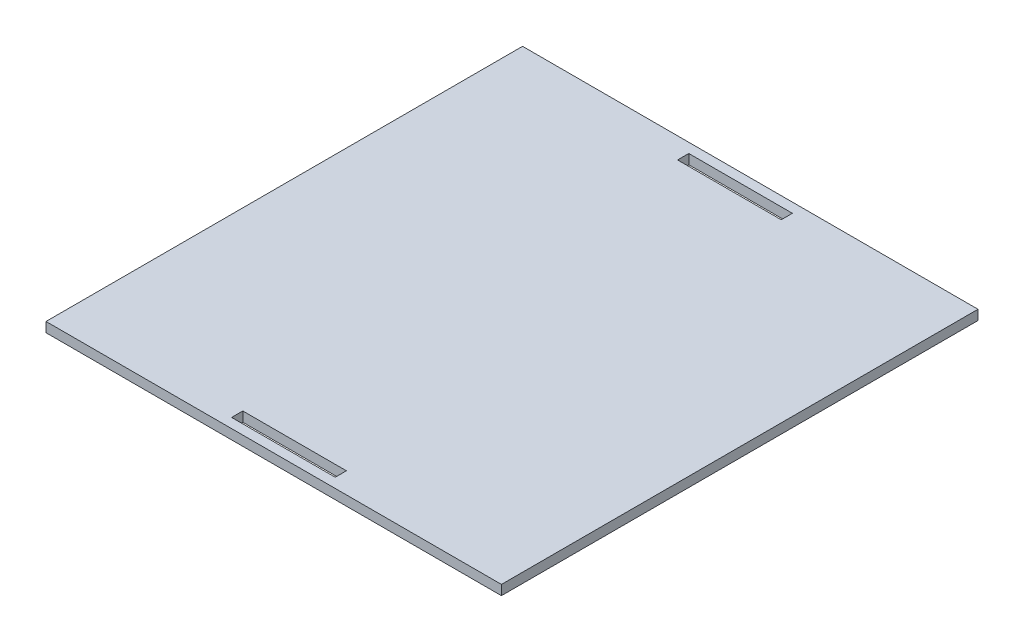
ISO-10303-21;
HEADER;
FILE_DESCRIPTION(('STEP AP214'),'2;1');
FILE_NAME('part.step','',(''),(''),'','','');
FILE_SCHEMA(('AUTOMOTIVE_DESIGN { 1 0 10303 214 1 1 1 1 }'));
ENDSEC;
DATA;
#1=APPLICATION_CONTEXT('core data for automotive mechanical design processes');
#2=APPLICATION_PROTOCOL_DEFINITION('international standard','automotive_design',2000,#1);
#3=PRODUCT_CONTEXT('',#1,'mechanical');
#4=PRODUCT('Part','Part','',(#3));
#5=PRODUCT_RELATED_PRODUCT_CATEGORY('part','',(#4));
#6=PRODUCT_DEFINITION_FORMATION('','',#4);
#7=PRODUCT_DEFINITION_CONTEXT('part definition',#1,'design');
#8=PRODUCT_DEFINITION('design','',#6,#7);
#9=PRODUCT_DEFINITION_SHAPE('','',#8);
#10=(LENGTH_UNIT() NAMED_UNIT(*) SI_UNIT(.MILLI.,.METRE.));
#11=(NAMED_UNIT(*) PLANE_ANGLE_UNIT() SI_UNIT($,.RADIAN.));
#12=(NAMED_UNIT(*) SI_UNIT($,.STERADIAN.) SOLID_ANGLE_UNIT());
#13=UNCERTAINTY_MEASURE_WITH_UNIT(LENGTH_MEASURE(1.E-05),#10,'distance_accuracy_value','');
#14=(GEOMETRIC_REPRESENTATION_CONTEXT(3) GLOBAL_UNCERTAINTY_ASSIGNED_CONTEXT((#13)) GLOBAL_UNIT_ASSIGNED_CONTEXT((#10,
#11,#12)) REPRESENTATION_CONTEXT('',''));
#15=CARTESIAN_POINT('',(0.,0.,0.));
#16=DIRECTION('',(0.,0.,1.));
#17=DIRECTION('',(1.,0.,0.));
#18=AXIS2_PLACEMENT_3D('',#15,#16,#17);
#19=CARTESIAN_POINT('',(0.,2.9972,0.));
#20=DIRECTION('',(0.,1.,0.));
#21=DIRECTION('',(0.,0.,1.));
#22=AXIS2_PLACEMENT_3D('',#19,#20,#21);
#23=PLANE('',#22);
#24=DIRECTION('',(0.,0.,1.));
#25=VECTOR('',#24,1.);
#26=CARTESIAN_POINT('',(-69.7864999999999,2.9972,73.025));
#27=LINE('',#26,#25);
#28=CARTESIAN_POINT('',(-69.7865,2.9972,-73.025));
#29=VERTEX_POINT('',#28);
#30=CARTESIAN_POINT('',(-69.7864999999999,2.9972,73.025));
#31=VERTEX_POINT('',#30);
#32=EDGE_CURVE('E220',#29,#31,#27,.T.);
#33=ORIENTED_EDGE('',*,*,#32,.T.);
#34=DIRECTION('',(1.,0.,0.));
#35=VECTOR('',#34,1.);
#36=CARTESIAN_POINT('',(69.7865000000001,2.9972,73.025));
#37=LINE('',#36,#35);
#38=CARTESIAN_POINT('',(69.7865000000001,2.9972,73.025));
#39=VERTEX_POINT('',#38);
#40=EDGE_CURVE('E224',#31,#39,#37,.T.);
#41=ORIENTED_EDGE('',*,*,#40,.T.);
#42=DIRECTION('',(0.,0.,-1.));
#43=VECTOR('',#42,1.);
#44=CARTESIAN_POINT('',(69.7865000000001,2.9972,73.025));
#45=LINE('',#44,#43);
#46=CARTESIAN_POINT('',(69.7865000000001,2.9972,-73.025));
#47=VERTEX_POINT('',#46);
#48=EDGE_CURVE('E228',#39,#47,#45,.T.);
#49=ORIENTED_EDGE('',*,*,#48,.T.);
#50=DIRECTION('',(-1.,0.,0.));
#51=VECTOR('',#50,1.);
#52=CARTESIAN_POINT('',(69.7865000000001,2.9972,-73.025));
#53=LINE('',#52,#51);
#54=EDGE_CURVE('E231',#47,#29,#53,.T.);
#55=ORIENTED_EDGE('',*,*,#54,.T.);
#56=EDGE_LOOP('',(#33,#41,#49,#55));
#57=FACE_BOUND('',#56,.T.);
#58=DIRECTION('',(1.,0.,0.));
#59=VECTOR('',#58,1.);
#60=CARTESIAN_POINT('',(-15.875,2.9972,-66.6242));
#61=LINE('',#60,#59);
#62=CARTESIAN_POINT('',(-15.875,2.9972,-66.6242));
#63=VERTEX_POINT('',#62);
#64=CARTESIAN_POINT('',(15.875,2.9972,-66.6242));
#65=VERTEX_POINT('',#64);
#66=EDGE_CURVE('E180',#63,#65,#61,.T.);
#67=ORIENTED_EDGE('',*,*,#66,.F.);
#68=DIRECTION('',(0.,0.,1.));
#69=VECTOR('',#68,1.);
#70=CARTESIAN_POINT('',(-15.875,2.9972,-70.0532));
#71=LINE('',#70,#69);
#72=CARTESIAN_POINT('',(-15.875,2.9972,-70.0532));
#73=VERTEX_POINT('',#72);
#74=EDGE_CURVE('E177',#73,#63,#71,.T.);
#75=ORIENTED_EDGE('',*,*,#74,.F.);
#76=DIRECTION('',(-1.,0.,0.));
#77=VECTOR('',#76,1.);
#78=CARTESIAN_POINT('',(-15.875,2.9972,-70.0532));
#79=LINE('',#78,#77);
#80=CARTESIAN_POINT('',(15.875,2.9972,-70.0532));
#81=VERTEX_POINT('',#80);
#82=EDGE_CURVE('E188',#81,#73,#79,.T.);
#83=ORIENTED_EDGE('',*,*,#82,.F.);
#84=DIRECTION('',(0.,0.,-1.));
#85=VECTOR('',#84,1.);
#86=CARTESIAN_POINT('',(15.875,2.9972,-70.0532));
#87=LINE('',#86,#85);
#88=EDGE_CURVE('E184',#65,#81,#87,.T.);
#89=ORIENTED_EDGE('',*,*,#88,.F.);
#90=EDGE_LOOP('',(#67,#75,#83,#89));
#91=FACE_BOUND('',#90,.T.);
#92=DIRECTION('',(1.,0.,0.));
#93=VECTOR('',#92,1.);
#94=CARTESIAN_POINT('',(-15.875,2.9972,70.0532));
#95=LINE('',#94,#93);
#96=CARTESIAN_POINT('',(-15.875,2.9972,70.0532));
#97=VERTEX_POINT('',#96);
#98=CARTESIAN_POINT('',(15.875,2.9972,70.0532));
#99=VERTEX_POINT('',#98);
#100=EDGE_CURVE('E138',#97,#99,#95,.T.);
#101=ORIENTED_EDGE('',*,*,#100,.F.);
#102=DIRECTION('',(0.,0.,1.));
#103=VECTOR('',#102,1.);
#104=CARTESIAN_POINT('',(-15.875,2.9972,66.6242));
#105=LINE('',#104,#103);
#106=CARTESIAN_POINT('',(-15.875,2.9972,66.6242));
#107=VERTEX_POINT('',#106);
#108=EDGE_CURVE('E129',#107,#97,#105,.T.);
#109=ORIENTED_EDGE('',*,*,#108,.F.);
#110=DIRECTION('',(-1.,0.,0.));
#111=VECTOR('',#110,1.);
#112=CARTESIAN_POINT('',(-15.875,2.9972,66.6242));
#113=LINE('',#112,#111);
#114=CARTESIAN_POINT('',(15.875,2.9972,66.6242));
#115=VERTEX_POINT('',#114);
#116=EDGE_CURVE('E155',#115,#107,#113,.T.);
#117=ORIENTED_EDGE('',*,*,#116,.F.);
#118=DIRECTION('',(0.,0.,-1.));
#119=VECTOR('',#118,1.);
#120=CARTESIAN_POINT('',(15.875,2.9972,66.6242));
#121=LINE('',#120,#119);
#122=EDGE_CURVE('E151',#99,#115,#121,.T.);
#123=ORIENTED_EDGE('',*,*,#122,.F.);
#124=EDGE_LOOP('',(#101,#109,#117,#123));
#125=FACE_BOUND('',#124,.T.);
#126=ADVANCED_FACE('F39',(#57,#91,#125),#23,.T.);
#127=CARTESIAN_POINT('',(0.,0.,0.));
#128=DIRECTION('',(0.,1.,0.));
#129=DIRECTION('',(0.,0.,1.));
#130=AXIS2_PLACEMENT_3D('',#127,#128,#129);
#131=PLANE('',#130);
#132=DIRECTION('',(0.,0.,1.));
#133=VECTOR('',#132,1.);
#134=CARTESIAN_POINT('',(-15.875,0.,-70.0532));
#135=LINE('',#134,#133);
#136=CARTESIAN_POINT('',(-15.875,0.,-70.0532));
#137=VERTEX_POINT('',#136);
#138=CARTESIAN_POINT('',(-15.875,0.,-66.6242));
#139=VERTEX_POINT('',#138);
#140=EDGE_CURVE('E147',#137,#139,#135,.T.);
#141=ORIENTED_EDGE('',*,*,#140,.T.);
#142=DIRECTION('',(1.,0.,0.));
#143=VECTOR('',#142,1.);
#144=CARTESIAN_POINT('',(-15.875,0.,-66.6242));
#145=LINE('',#144,#143);
#146=CARTESIAN_POINT('',(15.875,0.,-66.6242));
#147=VERTEX_POINT('',#146);
#148=EDGE_CURVE('E195',#139,#147,#145,.T.);
#149=ORIENTED_EDGE('',*,*,#148,.T.);
#150=DIRECTION('',(0.,0.,-1.));
#151=VECTOR('',#150,1.);
#152=CARTESIAN_POINT('',(15.875,0.,-70.0532));
#153=LINE('',#152,#151);
#154=CARTESIAN_POINT('',(15.875,0.,-70.0532));
#155=VERTEX_POINT('',#154);
#156=EDGE_CURVE('E199',#147,#155,#153,.T.);
#157=ORIENTED_EDGE('',*,*,#156,.T.);
#158=DIRECTION('',(-1.,0.,0.));
#159=VECTOR('',#158,1.);
#160=CARTESIAN_POINT('',(-15.875,0.,-70.0532));
#161=LINE('',#160,#159);
#162=EDGE_CURVE('E181',#155,#137,#161,.T.);
#163=ORIENTED_EDGE('',*,*,#162,.T.);
#164=EDGE_LOOP('',(#141,#149,#157,#163));
#165=FACE_BOUND('',#164,.T.);
#166=DIRECTION('',(0.,0.,1.));
#167=VECTOR('',#166,1.);
#168=CARTESIAN_POINT('',(-69.7864999999999,0.,73.025));
#169=LINE('',#168,#167);
#170=CARTESIAN_POINT('',(-69.7865,0.,-73.025));
#171=VERTEX_POINT('',#170);
#172=CARTESIAN_POINT('',(-69.7864999999999,0.,73.025));
#173=VERTEX_POINT('',#172);
#174=EDGE_CURVE('E219',#171,#173,#169,.T.);
#175=ORIENTED_EDGE('',*,*,#174,.F.);
#176=DIRECTION('',(-1.,0.,0.));
#177=VECTOR('',#176,1.);
#178=CARTESIAN_POINT('',(69.7865000000001,0.,-73.025));
#179=LINE('',#178,#177);
#180=CARTESIAN_POINT('',(69.7865000000001,0.,-73.025));
#181=VERTEX_POINT('',#180);
#182=EDGE_CURVE('E225',#181,#171,#179,.T.);
#183=ORIENTED_EDGE('',*,*,#182,.F.);
#184=DIRECTION('',(0.,0.,-1.));
#185=VECTOR('',#184,1.);
#186=CARTESIAN_POINT('',(69.7865000000001,0.,73.025));
#187=LINE('',#186,#185);
#188=CARTESIAN_POINT('',(69.7865000000001,0.,73.025));
#189=VERTEX_POINT('',#188);
#190=EDGE_CURVE('E241',#189,#181,#187,.T.);
#191=ORIENTED_EDGE('',*,*,#190,.F.);
#192=DIRECTION('',(1.,0.,0.));
#193=VECTOR('',#192,1.);
#194=CARTESIAN_POINT('',(69.7865000000001,0.,73.025));
#195=LINE('',#194,#193);
#196=EDGE_CURVE('E238',#173,#189,#195,.T.);
#197=ORIENTED_EDGE('',*,*,#196,.F.);
#198=EDGE_LOOP('',(#175,#183,#191,#197));
#199=FACE_BOUND('',#198,.T.);
#200=DIRECTION('',(0.,0.,1.));
#201=VECTOR('',#200,1.);
#202=CARTESIAN_POINT('',(-15.875,0.,66.6242));
#203=LINE('',#202,#201);
#204=CARTESIAN_POINT('',(-15.875,0.,66.6242));
#205=VERTEX_POINT('',#204);
#206=CARTESIAN_POINT('',(-15.875,0.,70.0532));
#207=VERTEX_POINT('',#206);
#208=EDGE_CURVE('E63',#205,#207,#203,.T.);
#209=ORIENTED_EDGE('',*,*,#208,.T.);
#210=DIRECTION('',(1.,0.,0.));
#211=VECTOR('',#210,1.);
#212=CARTESIAN_POINT('',(-15.875,0.,70.0532));
#213=LINE('',#212,#211);
#214=CARTESIAN_POINT('',(15.875,0.,70.0532));
#215=VERTEX_POINT('',#214);
#216=EDGE_CURVE('E145',#207,#215,#213,.T.);
#217=ORIENTED_EDGE('',*,*,#216,.T.);
#218=DIRECTION('',(0.,0.,-1.));
#219=VECTOR('',#218,1.);
#220=CARTESIAN_POINT('',(15.875,0.,66.6242));
#221=LINE('',#220,#219);
#222=CARTESIAN_POINT('',(15.875,0.,66.6242));
#223=VERTEX_POINT('',#222);
#224=EDGE_CURVE('E164',#215,#223,#221,.T.);
#225=ORIENTED_EDGE('',*,*,#224,.T.);
#226=DIRECTION('',(-1.,0.,0.));
#227=VECTOR('',#226,1.);
#228=CARTESIAN_POINT('',(-15.875,0.,66.6242));
#229=LINE('',#228,#227);
#230=EDGE_CURVE('E139',#223,#205,#229,.T.);
#231=ORIENTED_EDGE('',*,*,#230,.T.);
#232=EDGE_LOOP('',(#209,#217,#225,#231));
#233=FACE_BOUND('',#232,.T.);
#234=ADVANCED_FACE('F264',(#165,#199,#233),#131,.F.);
#235=CARTESIAN_POINT('',(-69.7864999999999,2.9972,73.025));
#236=DIRECTION('',(1.,0.,0.));
#237=DIRECTION('',(0.,0.,-1.));
#238=AXIS2_PLACEMENT_3D('',#235,#236,#237);
#239=PLANE('',#238);
#240=ORIENTED_EDGE('',*,*,#174,.T.);
#241=DIRECTION('',(0.,-1.,0.));
#242=VECTOR('',#241,1.);
#243=CARTESIAN_POINT('',(-69.7864999999999,2.9972,73.025));
#244=LINE('',#243,#242);
#245=EDGE_CURVE('E11',#31,#173,#244,.T.);
#246=ORIENTED_EDGE('',*,*,#245,.F.);
#247=ORIENTED_EDGE('',*,*,#32,.F.);
#248=DIRECTION('',(0.,-1.,0.));
#249=VECTOR('',#248,1.);
#250=CARTESIAN_POINT('',(-69.7865,2.9972,-73.025));
#251=LINE('',#250,#249);
#252=EDGE_CURVE('E234',#29,#171,#251,.T.);
#253=ORIENTED_EDGE('',*,*,#252,.T.);
#254=EDGE_LOOP('',(#240,#246,#247,#253));
#255=FACE_BOUND('',#254,.T.);
#256=ADVANCED_FACE('F41',(#255),#239,.F.);
#257=CARTESIAN_POINT('',(69.7865000000001,2.9972,73.025));
#258=DIRECTION('',(0.,0.,-1.));
#259=DIRECTION('',(-1.,0.,0.));
#260=AXIS2_PLACEMENT_3D('',#257,#258,#259);
#261=PLANE('',#260);
#262=ORIENTED_EDGE('',*,*,#196,.T.);
#263=DIRECTION('',(0.,-1.,0.));
#264=VECTOR('',#263,1.);
#265=CARTESIAN_POINT('',(69.7865000000001,2.9972,73.025));
#266=LINE('',#265,#264);
#267=EDGE_CURVE('E48',#39,#189,#266,.T.);
#268=ORIENTED_EDGE('',*,*,#267,.F.);
#269=ORIENTED_EDGE('',*,*,#40,.F.);
#270=ORIENTED_EDGE('',*,*,#245,.T.);
#271=EDGE_LOOP('',(#262,#268,#269,#270));
#272=FACE_BOUND('',#271,.T.);
#273=ADVANCED_FACE('F275',(#272),#261,.F.);
#274=CARTESIAN_POINT('',(69.7865000000001,2.9972,73.025));
#275=DIRECTION('',(-1.,0.,0.));
#276=DIRECTION('',(0.,0.,1.));
#277=AXIS2_PLACEMENT_3D('',#274,#275,#276);
#278=PLANE('',#277);
#279=ORIENTED_EDGE('',*,*,#190,.T.);
#280=DIRECTION('',(0.,-1.,0.));
#281=VECTOR('',#280,1.);
#282=CARTESIAN_POINT('',(69.7865000000001,2.9972,-73.025));
#283=LINE('',#282,#281);
#284=EDGE_CURVE('E249',#47,#181,#283,.T.);
#285=ORIENTED_EDGE('',*,*,#284,.F.);
#286=ORIENTED_EDGE('',*,*,#48,.F.);
#287=ORIENTED_EDGE('',*,*,#267,.T.);
#288=EDGE_LOOP('',(#279,#285,#286,#287));
#289=FACE_BOUND('',#288,.T.);
#290=ADVANCED_FACE('F258',(#289),#278,.F.);
#291=CARTESIAN_POINT('',(69.7865000000001,2.9972,-73.025));
#292=DIRECTION('',(0.,0.,1.));
#293=DIRECTION('',(1.,0.,0.));
#294=AXIS2_PLACEMENT_3D('',#291,#292,#293);
#295=PLANE('',#294);
#296=ORIENTED_EDGE('',*,*,#182,.T.);
#297=ORIENTED_EDGE('',*,*,#252,.F.);
#298=ORIENTED_EDGE('',*,*,#54,.F.);
#299=ORIENTED_EDGE('',*,*,#284,.T.);
#300=EDGE_LOOP('',(#296,#297,#298,#299));
#301=FACE_BOUND('',#300,.T.);
#302=ADVANCED_FACE('F268',(#301),#295,.F.);
#303=CARTESIAN_POINT('',(-15.875,2.9972,-70.0532));
#304=DIRECTION('',(1.,0.,0.));
#305=DIRECTION('',(0.,0.,-1.));
#306=AXIS2_PLACEMENT_3D('',#303,#304,#305);
#307=PLANE('',#306);
#308=ORIENTED_EDGE('',*,*,#140,.F.);
#309=DIRECTION('',(0.,-1.,0.));
#310=VECTOR('',#309,1.);
#311=CARTESIAN_POINT('',(-15.875,2.9972,-70.0532));
#312=LINE('',#311,#310);
#313=EDGE_CURVE('E191',#73,#137,#312,.T.);
#314=ORIENTED_EDGE('',*,*,#313,.F.);
#315=ORIENTED_EDGE('',*,*,#74,.T.);
#316=DIRECTION('',(0.,-1.,0.));
#317=VECTOR('',#316,1.);
#318=CARTESIAN_POINT('',(-15.875,2.9972,-66.6242));
#319=LINE('',#318,#317);
#320=EDGE_CURVE('E215',#63,#139,#319,.T.);
#321=ORIENTED_EDGE('',*,*,#320,.T.);
#322=EDGE_LOOP('',(#308,#314,#315,#321));
#323=FACE_BOUND('',#322,.T.);
#324=ADVANCED_FACE('F290',(#323),#307,.T.);
#325=CARTESIAN_POINT('',(-15.875,2.9972,-66.6242));
#326=DIRECTION('',(0.,0.,-1.));
#327=DIRECTION('',(-1.,0.,0.));
#328=AXIS2_PLACEMENT_3D('',#325,#326,#327);
#329=PLANE('',#328);
#330=ORIENTED_EDGE('',*,*,#148,.F.);
#331=ORIENTED_EDGE('',*,*,#320,.F.);
#332=ORIENTED_EDGE('',*,*,#66,.T.);
#333=DIRECTION('',(0.,-1.,0.));
#334=VECTOR('',#333,1.);
#335=CARTESIAN_POINT('',(15.875,2.9972,-66.6242));
#336=LINE('',#335,#334);
#337=EDGE_CURVE('E212',#65,#147,#336,.T.);
#338=ORIENTED_EDGE('',*,*,#337,.T.);
#339=EDGE_LOOP('',(#330,#331,#332,#338));
#340=FACE_BOUND('',#339,.T.);
#341=ADVANCED_FACE('F297',(#340),#329,.T.);
#342=CARTESIAN_POINT('',(15.875,2.9972,-70.0532));
#343=DIRECTION('',(-1.,0.,0.));
#344=DIRECTION('',(0.,0.,1.));
#345=AXIS2_PLACEMENT_3D('',#342,#343,#344);
#346=PLANE('',#345);
#347=ORIENTED_EDGE('',*,*,#156,.F.);
#348=ORIENTED_EDGE('',*,*,#337,.F.);
#349=ORIENTED_EDGE('',*,*,#88,.T.);
#350=DIRECTION('',(0.,-1.,0.));
#351=VECTOR('',#350,1.);
#352=CARTESIAN_POINT('',(15.875,2.9972,-70.0532));
#353=LINE('',#352,#351);
#354=EDGE_CURVE('E209',#81,#155,#353,.T.);
#355=ORIENTED_EDGE('',*,*,#354,.T.);
#356=EDGE_LOOP('',(#347,#348,#349,#355));
#357=FACE_BOUND('',#356,.T.);
#358=ADVANCED_FACE('F302',(#357),#346,.T.);
#359=CARTESIAN_POINT('',(-15.875,2.9972,-70.0532));
#360=DIRECTION('',(0.,0.,1.));
#361=DIRECTION('',(1.,0.,0.));
#362=AXIS2_PLACEMENT_3D('',#359,#360,#361);
#363=PLANE('',#362);
#364=ORIENTED_EDGE('',*,*,#162,.F.);
#365=ORIENTED_EDGE('',*,*,#354,.F.);
#366=ORIENTED_EDGE('',*,*,#82,.T.);
#367=ORIENTED_EDGE('',*,*,#313,.T.);
#368=EDGE_LOOP('',(#364,#365,#366,#367));
#369=FACE_BOUND('',#368,.T.);
#370=ADVANCED_FACE('F309',(#369),#363,.T.);
#371=CARTESIAN_POINT('',(-15.875,2.9972,66.6242));
#372=DIRECTION('',(1.,0.,0.));
#373=DIRECTION('',(0.,0.,-1.));
#374=AXIS2_PLACEMENT_3D('',#371,#372,#373);
#375=PLANE('',#374);
#376=ORIENTED_EDGE('',*,*,#208,.F.);
#377=DIRECTION('',(0.,-1.,0.));
#378=VECTOR('',#377,1.);
#379=CARTESIAN_POINT('',(-15.875,2.9972,66.6242));
#380=LINE('',#379,#378);
#381=EDGE_CURVE('E133',#107,#205,#380,.T.);
#382=ORIENTED_EDGE('',*,*,#381,.F.);
#383=ORIENTED_EDGE('',*,*,#108,.T.);
#384=DIRECTION('',(0.,-1.,0.));
#385=VECTOR('',#384,1.);
#386=CARTESIAN_POINT('',(-15.875,2.9972,70.0532));
#387=LINE('',#386,#385);
#388=EDGE_CURVE('E132',#97,#207,#387,.T.);
#389=ORIENTED_EDGE('',*,*,#388,.T.);
#390=EDGE_LOOP('',(#376,#382,#383,#389));
#391=FACE_BOUND('',#390,.T.);
#392=ADVANCED_FACE('F131',(#391),#375,.T.);
#393=CARTESIAN_POINT('',(-15.875,2.9972,70.0532));
#394=DIRECTION('',(0.,0.,-1.));
#395=DIRECTION('',(-1.,0.,0.));
#396=AXIS2_PLACEMENT_3D('',#393,#394,#395);
#397=PLANE('',#396);
#398=ORIENTED_EDGE('',*,*,#216,.F.);
#399=ORIENTED_EDGE('',*,*,#388,.F.);
#400=ORIENTED_EDGE('',*,*,#100,.T.);
#401=DIRECTION('',(0.,-1.,0.));
#402=VECTOR('',#401,1.);
#403=CARTESIAN_POINT('',(15.875,2.9972,70.0532));
#404=LINE('',#403,#402);
#405=EDGE_CURVE('E148',#99,#215,#404,.T.);
#406=ORIENTED_EDGE('',*,*,#405,.T.);
#407=EDGE_LOOP('',(#398,#399,#400,#406));
#408=FACE_BOUND('',#407,.T.);
#409=ADVANCED_FACE('F142',(#408),#397,.T.);
#410=CARTESIAN_POINT('',(15.875,2.9972,66.6242));
#411=DIRECTION('',(-1.,0.,0.));
#412=DIRECTION('',(0.,0.,1.));
#413=AXIS2_PLACEMENT_3D('',#410,#411,#412);
#414=PLANE('',#413);
#415=ORIENTED_EDGE('',*,*,#224,.F.);
#416=ORIENTED_EDGE('',*,*,#405,.F.);
#417=ORIENTED_EDGE('',*,*,#122,.T.);
#418=DIRECTION('',(0.,-1.,0.));
#419=VECTOR('',#418,1.);
#420=CARTESIAN_POINT('',(15.875,2.9972,66.6242));
#421=LINE('',#420,#419);
#422=EDGE_CURVE('E55',#115,#223,#421,.T.);
#423=ORIENTED_EDGE('',*,*,#422,.T.);
#424=EDGE_LOOP('',(#415,#416,#417,#423));
#425=FACE_BOUND('',#424,.T.);
#426=ADVANCED_FACE('F327',(#425),#414,.T.);
#427=CARTESIAN_POINT('',(-15.875,2.9972,66.6242));
#428=DIRECTION('',(0.,0.,1.));
#429=DIRECTION('',(1.,0.,0.));
#430=AXIS2_PLACEMENT_3D('',#427,#428,#429);
#431=PLANE('',#430);
#432=ORIENTED_EDGE('',*,*,#230,.F.);
#433=ORIENTED_EDGE('',*,*,#422,.F.);
#434=ORIENTED_EDGE('',*,*,#116,.T.);
#435=ORIENTED_EDGE('',*,*,#381,.T.);
#436=EDGE_LOOP('',(#432,#433,#434,#435));
#437=FACE_BOUND('',#436,.T.);
#438=ADVANCED_FACE('F330',(#437),#431,.T.);
#439=CLOSED_SHELL('',(#126,#234,#256,#273,#290,#302,#324,#341,#358,#370,#392,#409,#426,#438));
#440=MANIFOLD_SOLID_BREP('B2',#439);
#441=ADVANCED_BREP_SHAPE_REPRESENTATION('',(#18,#440),#14);
#442=SHAPE_DEFINITION_REPRESENTATION(#9,#441);
ENDSEC;
END-ISO-10303-21;
